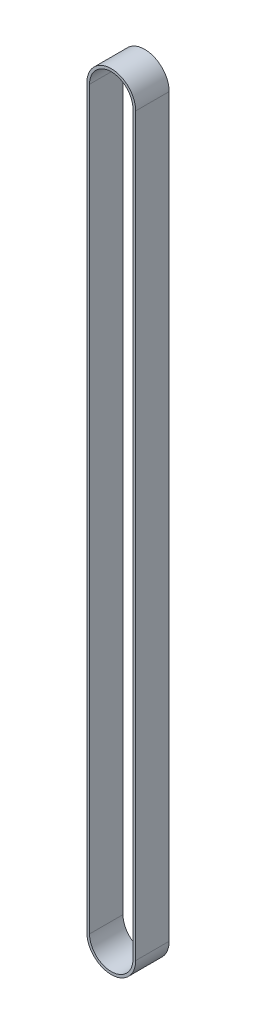
ISO-10303-21;
HEADER;
FILE_DESCRIPTION(('STEP AP214'),'2;1');
FILE_NAME('part.step','',(''),(''),'','','');
FILE_SCHEMA(('AUTOMOTIVE_DESIGN { 1 0 10303 214 1 1 1 1 }'));
ENDSEC;
DATA;
#1=APPLICATION_CONTEXT('core data for automotive mechanical design processes');
#2=APPLICATION_PROTOCOL_DEFINITION('international standard','automotive_design',2000,#1);
#3=PRODUCT_CONTEXT('',#1,'mechanical');
#4=PRODUCT('Part','Part','',(#3));
#5=PRODUCT_RELATED_PRODUCT_CATEGORY('part','',(#4));
#6=PRODUCT_DEFINITION_FORMATION('','',#4);
#7=PRODUCT_DEFINITION_CONTEXT('part definition',#1,'design');
#8=PRODUCT_DEFINITION('design','',#6,#7);
#9=PRODUCT_DEFINITION_SHAPE('','',#8);
#10=(LENGTH_UNIT() NAMED_UNIT(*) SI_UNIT(.MILLI.,.METRE.));
#11=(NAMED_UNIT(*) PLANE_ANGLE_UNIT() SI_UNIT($,.RADIAN.));
#12=(NAMED_UNIT(*) SI_UNIT($,.STERADIAN.) SOLID_ANGLE_UNIT());
#13=UNCERTAINTY_MEASURE_WITH_UNIT(LENGTH_MEASURE(1.E-05),#10,'distance_accuracy_value','');
#14=(GEOMETRIC_REPRESENTATION_CONTEXT(3) GLOBAL_UNCERTAINTY_ASSIGNED_CONTEXT((#13)) GLOBAL_UNIT_ASSIGNED_CONTEXT((#10,
#11,#12)) REPRESENTATION_CONTEXT('',''));
#15=CARTESIAN_POINT('',(0.,0.,0.));
#16=DIRECTION('',(0.,0.,1.));
#17=DIRECTION('',(1.,0.,0.));
#18=AXIS2_PLACEMENT_3D('',#15,#16,#17);
#19=CARTESIAN_POINT('',(0.,0.,0.));
#20=DIRECTION('',(0.,0.,1.));
#21=DIRECTION('',(1.,0.,0.));
#22=AXIS2_PLACEMENT_3D('',#19,#20,#21);
#23=PLANE('',#22);
#24=CARTESIAN_POINT('',(0.,220.,0.));
#25=DIRECTION('',(0.,0.,1.));
#26=DIRECTION('',(1.,0.,0.));
#27=AXIS2_PLACEMENT_3D('',#24,#25,#26);
#28=CIRCLE('',#27,6.5);
#29=CARTESIAN_POINT('',(6.5,220.,0.));
#30=VERTEX_POINT('',#29);
#31=CARTESIAN_POINT('',(-6.5,220.,0.));
#32=VERTEX_POINT('',#31);
#33=EDGE_CURVE('E163',#30,#32,#28,.T.);
#34=ORIENTED_EDGE('',*,*,#33,.T.);
#35=DIRECTION('',(0.,1.,0.));
#36=VECTOR('',#35,1.);
#37=CARTESIAN_POINT('',(-6.5,0.,0.));
#38=LINE('',#37,#36);
#39=CARTESIAN_POINT('',(-6.5,0.,0.));
#40=VERTEX_POINT('',#39);
#41=EDGE_CURVE('E27',#40,#32,#38,.T.);
#42=ORIENTED_EDGE('',*,*,#41,.F.);
#43=CARTESIAN_POINT('',(0.,0.,0.));
#44=DIRECTION('',(0.,0.,1.));
#45=DIRECTION('',(1.,0.,0.));
#46=AXIS2_PLACEMENT_3D('',#43,#44,#45);
#47=CIRCLE('',#46,6.5);
#48=CARTESIAN_POINT('',(6.5,0.,0.));
#49=VERTEX_POINT('',#48);
#50=EDGE_CURVE('E92',#40,#49,#47,.T.);
#51=ORIENTED_EDGE('',*,*,#50,.T.);
#52=DIRECTION('',(0.,1.,0.));
#53=VECTOR('',#52,1.);
#54=CARTESIAN_POINT('',(6.5,0.,0.));
#55=LINE('',#54,#53);
#56=EDGE_CURVE('E158',#49,#30,#55,.T.);
#57=ORIENTED_EDGE('',*,*,#56,.T.);
#58=EDGE_LOOP('',(#34,#42,#51,#57));
#59=FACE_BOUND('',#58,.T.);
#60=DIRECTION('',(0.,1.,0.));
#61=VECTOR('',#60,1.);
#62=CARTESIAN_POINT('',(7.3,0.,0.));
#63=LINE('',#62,#61);
#64=CARTESIAN_POINT('',(7.3,0.,0.));
#65=VERTEX_POINT('',#64);
#66=CARTESIAN_POINT('',(7.3,220.,0.));
#67=VERTEX_POINT('',#66);
#68=EDGE_CURVE('E159',#65,#67,#63,.T.);
#69=ORIENTED_EDGE('',*,*,#68,.F.);
#70=CARTESIAN_POINT('',(0.,0.,0.));
#71=DIRECTION('',(0.,0.,1.));
#72=DIRECTION('',(1.,0.,0.));
#73=AXIS2_PLACEMENT_3D('',#70,#71,#72);
#74=CIRCLE('',#73,7.3);
#75=CARTESIAN_POINT('',(-7.3,0.,0.));
#76=VERTEX_POINT('',#75);
#77=EDGE_CURVE('E55',#76,#65,#74,.T.);
#78=ORIENTED_EDGE('',*,*,#77,.F.);
#79=DIRECTION('',(0.,1.,0.));
#80=VECTOR('',#79,1.);
#81=CARTESIAN_POINT('',(-7.3,0.,0.));
#82=LINE('',#81,#80);
#83=CARTESIAN_POINT('',(-7.3,220.,0.));
#84=VERTEX_POINT('',#83);
#85=EDGE_CURVE('E116',#76,#84,#82,.T.);
#86=ORIENTED_EDGE('',*,*,#85,.T.);
#87=CARTESIAN_POINT('',(0.,220.,0.));
#88=DIRECTION('',(0.,0.,1.));
#89=DIRECTION('',(1.,0.,0.));
#90=AXIS2_PLACEMENT_3D('',#87,#88,#89);
#91=CIRCLE('',#90,7.3);
#92=EDGE_CURVE('E119',#67,#84,#91,.T.);
#93=ORIENTED_EDGE('',*,*,#92,.F.);
#94=EDGE_LOOP('',(#69,#78,#86,#93));
#95=FACE_BOUND('',#94,.T.);
#96=ADVANCED_FACE('F17',(#59,#95),#23,.F.);
#97=CARTESIAN_POINT('',(0.,0.,10.));
#98=DIRECTION('',(0.,0.,1.));
#99=DIRECTION('',(1.,0.,0.));
#100=AXIS2_PLACEMENT_3D('',#97,#98,#99);
#101=PLANE('',#100);
#102=CARTESIAN_POINT('',(0.,220.,10.));
#103=DIRECTION('',(0.,0.,1.));
#104=DIRECTION('',(1.,0.,0.));
#105=AXIS2_PLACEMENT_3D('',#102,#103,#104);
#106=CIRCLE('',#105,6.5);
#107=CARTESIAN_POINT('',(6.5,220.,10.));
#108=VERTEX_POINT('',#107);
#109=CARTESIAN_POINT('',(-6.5,220.,10.));
#110=VERTEX_POINT('',#109);
#111=EDGE_CURVE('E21',#108,#110,#106,.T.);
#112=ORIENTED_EDGE('',*,*,#111,.F.);
#113=DIRECTION('',(0.,1.,0.));
#114=VECTOR('',#113,1.);
#115=CARTESIAN_POINT('',(6.5,0.,10.));
#116=LINE('',#115,#114);
#117=CARTESIAN_POINT('',(6.5,0.,10.));
#118=VERTEX_POINT('',#117);
#119=EDGE_CURVE('E157',#118,#108,#116,.T.);
#120=ORIENTED_EDGE('',*,*,#119,.F.);
#121=CARTESIAN_POINT('',(0.,0.,10.));
#122=DIRECTION('',(0.,0.,1.));
#123=DIRECTION('',(1.,0.,0.));
#124=AXIS2_PLACEMENT_3D('',#121,#122,#123);
#125=CIRCLE('',#124,6.5);
#126=CARTESIAN_POINT('',(-6.5,0.,10.));
#127=VERTEX_POINT('',#126);
#128=EDGE_CURVE('E162',#127,#118,#125,.T.);
#129=ORIENTED_EDGE('',*,*,#128,.F.);
#130=DIRECTION('',(0.,1.,0.));
#131=VECTOR('',#130,1.);
#132=CARTESIAN_POINT('',(-6.5,0.,10.));
#133=LINE('',#132,#131);
#134=EDGE_CURVE('E11',#127,#110,#133,.T.);
#135=ORIENTED_EDGE('',*,*,#134,.T.);
#136=EDGE_LOOP('',(#112,#120,#129,#135));
#137=FACE_BOUND('',#136,.T.);
#138=DIRECTION('',(0.,1.,0.));
#139=VECTOR('',#138,1.);
#140=CARTESIAN_POINT('',(7.3,0.,10.));
#141=LINE('',#140,#139);
#142=CARTESIAN_POINT('',(7.3,0.,10.));
#143=VERTEX_POINT('',#142);
#144=CARTESIAN_POINT('',(7.3,220.,10.));
#145=VERTEX_POINT('',#144);
#146=EDGE_CURVE('E147',#143,#145,#141,.T.);
#147=ORIENTED_EDGE('',*,*,#146,.T.);
#148=CARTESIAN_POINT('',(0.,220.,10.));
#149=DIRECTION('',(0.,0.,1.));
#150=DIRECTION('',(1.,0.,0.));
#151=AXIS2_PLACEMENT_3D('',#148,#149,#150);
#152=CIRCLE('',#151,7.3);
#153=CARTESIAN_POINT('',(-7.3,220.,10.));
#154=VERTEX_POINT('',#153);
#155=EDGE_CURVE('E125',#145,#154,#152,.T.);
#156=ORIENTED_EDGE('',*,*,#155,.T.);
#157=DIRECTION('',(0.,1.,0.));
#158=VECTOR('',#157,1.);
#159=CARTESIAN_POINT('',(-7.3,0.,10.));
#160=LINE('',#159,#158);
#161=CARTESIAN_POINT('',(-7.3,0.,10.));
#162=VERTEX_POINT('',#161);
#163=EDGE_CURVE('E130',#162,#154,#160,.T.);
#164=ORIENTED_EDGE('',*,*,#163,.F.);
#165=CARTESIAN_POINT('',(0.,0.,10.));
#166=DIRECTION('',(0.,0.,1.));
#167=DIRECTION('',(1.,0.,0.));
#168=AXIS2_PLACEMENT_3D('',#165,#166,#167);
#169=CIRCLE('',#168,7.3);
#170=EDGE_CURVE('E41',#162,#143,#169,.T.);
#171=ORIENTED_EDGE('',*,*,#170,.T.);
#172=EDGE_LOOP('',(#147,#156,#164,#171));
#173=FACE_BOUND('',#172,.T.);
#174=ADVANCED_FACE('F292',(#137,#173),#101,.T.);
#175=CARTESIAN_POINT('',(-6.5,0.,10.));
#176=DIRECTION('',(-1.,0.,0.));
#177=DIRECTION('',(0.,0.,1.));
#178=AXIS2_PLACEMENT_3D('',#175,#176,#177);
#179=PLANE('',#178);
#180=ORIENTED_EDGE('',*,*,#41,.T.);
#181=DIRECTION('',(0.,0.,-1.));
#182=VECTOR('',#181,1.);
#183=CARTESIAN_POINT('',(-6.5,220.,10.));
#184=LINE('',#183,#182);
#185=EDGE_CURVE('E173',#110,#32,#184,.T.);
#186=ORIENTED_EDGE('',*,*,#185,.F.);
#187=ORIENTED_EDGE('',*,*,#134,.F.);
#188=DIRECTION('',(0.,0.,-1.));
#189=VECTOR('',#188,1.);
#190=CARTESIAN_POINT('',(-6.5,0.,10.));
#191=LINE('',#190,#189);
#192=EDGE_CURVE('E177',#127,#40,#191,.T.);
#193=ORIENTED_EDGE('',*,*,#192,.T.);
#194=EDGE_LOOP('',(#180,#186,#187,#193));
#195=FACE_BOUND('',#194,.T.);
#196=ADVANCED_FACE('F215',(#195),#179,.F.);
#197=CARTESIAN_POINT('',(0.,0.,10.));
#198=DIRECTION('',(0.,0.,-1.));
#199=DIRECTION('',(-1.,0.,0.));
#200=AXIS2_PLACEMENT_3D('',#197,#198,#199);
#201=CYLINDRICAL_SURFACE('',#200,7.3);
#202=ORIENTED_EDGE('',*,*,#77,.T.);
#203=DIRECTION('',(0.,0.,-1.));
#204=VECTOR('',#203,1.);
#205=CARTESIAN_POINT('',(7.3,0.,10.));
#206=LINE('',#205,#204);
#207=EDGE_CURVE('E141',#143,#65,#206,.T.);
#208=ORIENTED_EDGE('',*,*,#207,.F.);
#209=ORIENTED_EDGE('',*,*,#170,.F.);
#210=DIRECTION('',(0.,0.,-1.));
#211=VECTOR('',#210,1.);
#212=CARTESIAN_POINT('',(-7.3,0.,10.));
#213=LINE('',#212,#211);
#214=EDGE_CURVE('E124',#162,#76,#213,.T.);
#215=ORIENTED_EDGE('',*,*,#214,.T.);
#216=EDGE_LOOP('',(#202,#208,#209,#215));
#217=FACE_BOUND('',#216,.T.);
#218=ADVANCED_FACE('F190',(#217),#201,.T.);
#219=CARTESIAN_POINT('',(-7.3,0.,10.));
#220=DIRECTION('',(-1.,0.,0.));
#221=DIRECTION('',(0.,0.,1.));
#222=AXIS2_PLACEMENT_3D('',#219,#220,#221);
#223=PLANE('',#222);
#224=ORIENTED_EDGE('',*,*,#85,.F.);
#225=ORIENTED_EDGE('',*,*,#214,.F.);
#226=ORIENTED_EDGE('',*,*,#163,.T.);
#227=DIRECTION('',(0.,0.,-1.));
#228=VECTOR('',#227,1.);
#229=CARTESIAN_POINT('',(-7.3,220.,10.));
#230=LINE('',#229,#228);
#231=EDGE_CURVE('E128',#154,#84,#230,.T.);
#232=ORIENTED_EDGE('',*,*,#231,.T.);
#233=EDGE_LOOP('',(#224,#225,#226,#232));
#234=FACE_BOUND('',#233,.T.);
#235=ADVANCED_FACE('F129',(#234),#223,.T.);
#236=CARTESIAN_POINT('',(0.,220.,10.));
#237=DIRECTION('',(0.,0.,-1.));
#238=DIRECTION('',(-1.,0.,0.));
#239=AXIS2_PLACEMENT_3D('',#236,#237,#238);
#240=CYLINDRICAL_SURFACE('',#239,7.3);
#241=ORIENTED_EDGE('',*,*,#92,.T.);
#242=ORIENTED_EDGE('',*,*,#231,.F.);
#243=ORIENTED_EDGE('',*,*,#155,.F.);
#244=DIRECTION('',(0.,0.,-1.));
#245=VECTOR('',#244,1.);
#246=CARTESIAN_POINT('',(7.3,220.,10.));
#247=LINE('',#246,#245);
#248=EDGE_CURVE('E138',#145,#67,#247,.T.);
#249=ORIENTED_EDGE('',*,*,#248,.T.);
#250=EDGE_LOOP('',(#241,#242,#243,#249));
#251=FACE_BOUND('',#250,.T.);
#252=ADVANCED_FACE('F136',(#251),#240,.T.);
#253=CARTESIAN_POINT('',(7.3,0.,10.));
#254=DIRECTION('',(-1.,0.,0.));
#255=DIRECTION('',(0.,0.,1.));
#256=AXIS2_PLACEMENT_3D('',#253,#254,#255);
#257=PLANE('',#256);
#258=ORIENTED_EDGE('',*,*,#68,.T.);
#259=ORIENTED_EDGE('',*,*,#248,.F.);
#260=ORIENTED_EDGE('',*,*,#146,.F.);
#261=ORIENTED_EDGE('',*,*,#207,.T.);
#262=EDGE_LOOP('',(#258,#259,#260,#261));
#263=FACE_BOUND('',#262,.T.);
#264=ADVANCED_FACE('F195',(#263),#257,.F.);
#265=CARTESIAN_POINT('',(0.,0.,10.));
#266=DIRECTION('',(0.,0.,-1.));
#267=DIRECTION('',(-1.,0.,0.));
#268=AXIS2_PLACEMENT_3D('',#265,#266,#267);
#269=CYLINDRICAL_SURFACE('',#268,6.5);
#270=ORIENTED_EDGE('',*,*,#50,.F.);
#271=ORIENTED_EDGE('',*,*,#192,.F.);
#272=ORIENTED_EDGE('',*,*,#128,.T.);
#273=DIRECTION('',(0.,0.,-1.));
#274=VECTOR('',#273,1.);
#275=CARTESIAN_POINT('',(6.5,0.,10.));
#276=LINE('',#275,#274);
#277=EDGE_CURVE('E154',#118,#49,#276,.T.);
#278=ORIENTED_EDGE('',*,*,#277,.T.);
#279=EDGE_LOOP('',(#270,#271,#272,#278));
#280=FACE_BOUND('',#279,.T.);
#281=ADVANCED_FACE('F218',(#280),#269,.F.);
#282=CARTESIAN_POINT('',(6.5,0.,10.));
#283=DIRECTION('',(-1.,0.,0.));
#284=DIRECTION('',(0.,0.,1.));
#285=AXIS2_PLACEMENT_3D('',#282,#283,#284);
#286=PLANE('',#285);
#287=ORIENTED_EDGE('',*,*,#56,.F.);
#288=ORIENTED_EDGE('',*,*,#277,.F.);
#289=ORIENTED_EDGE('',*,*,#119,.T.);
#290=DIRECTION('',(0.,0.,-1.));
#291=VECTOR('',#290,1.);
#292=CARTESIAN_POINT('',(6.5,220.,10.));
#293=LINE('',#292,#291);
#294=EDGE_CURVE('E167',#108,#30,#293,.T.);
#295=ORIENTED_EDGE('',*,*,#294,.T.);
#296=EDGE_LOOP('',(#287,#288,#289,#295));
#297=FACE_BOUND('',#296,.T.);
#298=ADVANCED_FACE('F210',(#297),#286,.T.);
#299=CARTESIAN_POINT('',(0.,220.,10.));
#300=DIRECTION('',(0.,0.,-1.));
#301=DIRECTION('',(-1.,0.,0.));
#302=AXIS2_PLACEMENT_3D('',#299,#300,#301);
#303=CYLINDRICAL_SURFACE('',#302,6.5);
#304=ORIENTED_EDGE('',*,*,#33,.F.);
#305=ORIENTED_EDGE('',*,*,#294,.F.);
#306=ORIENTED_EDGE('',*,*,#111,.T.);
#307=ORIENTED_EDGE('',*,*,#185,.T.);
#308=EDGE_LOOP('',(#304,#305,#306,#307));
#309=FACE_BOUND('',#308,.T.);
#310=ADVANCED_FACE('F19',(#309),#303,.F.);
#311=CLOSED_SHELL('',(#96,#174,#196,#218,#235,#252,#264,#281,#298,#310));
#312=MANIFOLD_SOLID_BREP('B1',#311);
#313=ADVANCED_BREP_SHAPE_REPRESENTATION('',(#18,#312),#14);
#314=SHAPE_DEFINITION_REPRESENTATION(#9,#313);
ENDSEC;
END-ISO-10303-21;
